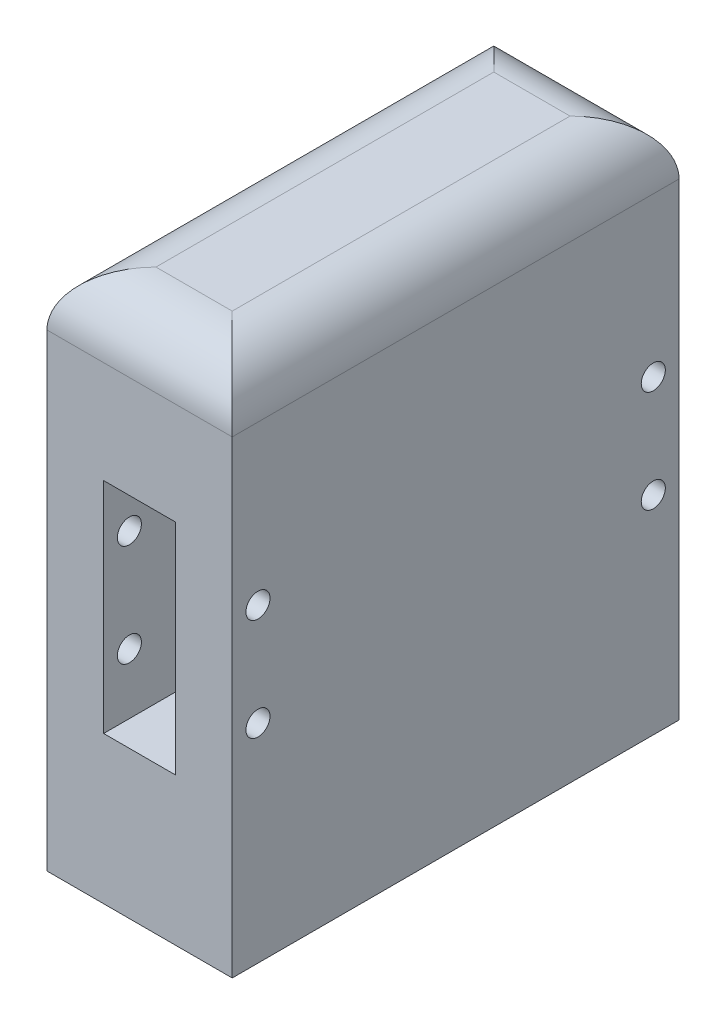
ISO-10303-21;
HEADER;
FILE_DESCRIPTION(('STEP AP214'),'2;1');
FILE_NAME('part.step','',(''),(''),'','','');
FILE_SCHEMA(('AUTOMOTIVE_DESIGN { 1 0 10303 214 1 1 1 1 }'));
ENDSEC;
DATA;
#1=APPLICATION_CONTEXT('core data for automotive mechanical design processes');
#2=APPLICATION_PROTOCOL_DEFINITION('international standard','automotive_design',2000,#1);
#3=PRODUCT_CONTEXT('',#1,'mechanical');
#4=PRODUCT('Part','Part','',(#3));
#5=PRODUCT_RELATED_PRODUCT_CATEGORY('part','',(#4));
#6=PRODUCT_DEFINITION_FORMATION('','',#4);
#7=PRODUCT_DEFINITION_CONTEXT('part definition',#1,'design');
#8=PRODUCT_DEFINITION('design','',#6,#7);
#9=PRODUCT_DEFINITION_SHAPE('','',#8);
#10=(LENGTH_UNIT() NAMED_UNIT(*) SI_UNIT(.MILLI.,.METRE.));
#11=(NAMED_UNIT(*) PLANE_ANGLE_UNIT() SI_UNIT($,.RADIAN.));
#12=(NAMED_UNIT(*) SI_UNIT($,.STERADIAN.) SOLID_ANGLE_UNIT());
#13=UNCERTAINTY_MEASURE_WITH_UNIT(LENGTH_MEASURE(1.E-05),#10,'distance_accuracy_value','');
#14=(GEOMETRIC_REPRESENTATION_CONTEXT(3) GLOBAL_UNCERTAINTY_ASSIGNED_CONTEXT((#13)) GLOBAL_UNIT_ASSIGNED_CONTEXT((#10,
#11,#12)) REPRESENTATION_CONTEXT('',''));
#15=CARTESIAN_POINT('',(0.,0.,0.));
#16=DIRECTION('',(0.,0.,1.));
#17=DIRECTION('',(1.,0.,0.));
#18=AXIS2_PLACEMENT_3D('',#15,#16,#17);
#19=CARTESIAN_POINT('',(-3.3,13.5324143557873,20.5));
#20=DIRECTION('',(-1.,0.,0.));
#21=DIRECTION('',(0.,0.,1.));
#22=AXIS2_PLACEMENT_3D('',#19,#20,#21);
#23=PLANE('',#22);
#24=CARTESIAN_POINT('',(-3.3,19.075341505193,-18.138));
#25=DIRECTION('',(-1.,0.,0.));
#26=DIRECTION('',(0.,0.,1.));
#27=AXIS2_PLACEMENT_3D('',#24,#25,#26);
#28=CIRCLE('',#27,1.105);
#29=CARTESIAN_POINT('',(-3.3,19.075341505193,-17.033));
#30=VERTEX_POINT('',#29);
#31=EDGE_CURVE('E322',#30,#30,#28,.T.);
#32=ORIENTED_EDGE('',*,*,#31,.T.);
#33=EDGE_LOOP('',(#32));
#34=FACE_BOUND('',#33,.T.);
#35=CARTESIAN_POINT('',(-3.3,28.455341505193,-18.138));
#36=DIRECTION('',(-1.,0.,0.));
#37=DIRECTION('',(0.,0.,1.));
#38=AXIS2_PLACEMENT_3D('',#35,#36,#37);
#39=CIRCLE('',#38,1.105);
#40=CARTESIAN_POINT('',(-3.3,28.455341505193,-17.033));
#41=VERTEX_POINT('',#40);
#42=EDGE_CURVE('E318',#41,#41,#39,.T.);
#43=ORIENTED_EDGE('',*,*,#42,.T.);
#44=EDGE_LOOP('',(#43));
#45=FACE_BOUND('',#44,.T.);
#46=DIRECTION('',(0.,1.,0.));
#47=VECTOR('',#46,1.);
#48=CARTESIAN_POINT('',(-3.3,13.5324143557873,-13.6722928862132));
#49=LINE('',#48,#47);
#50=CARTESIAN_POINT('',(-3.3,27.,-13.6722928862132));
#51=VERTEX_POINT('',#50);
#52=CARTESIAN_POINT('',(-3.3,33.6324143557873,-13.6722928862132));
#53=VERTEX_POINT('',#52);
#54=EDGE_CURVE('E261',#51,#53,#49,.T.);
#55=ORIENTED_EDGE('',*,*,#54,.F.);
#56=DIRECTION('',(0.,0.,1.));
#57=VECTOR('',#56,1.);
#58=CARTESIAN_POINT('',(-3.3,27.,20.5));
#59=LINE('',#58,#57);
#60=CARTESIAN_POINT('',(-3.3,27.,-5.48361194834208));
#61=VERTEX_POINT('',#60);
#62=EDGE_CURVE('E245',#51,#61,#59,.T.);
#63=ORIENTED_EDGE('',*,*,#62,.T.);
#64=DIRECTION('',(0.,-1.,0.));
#65=VECTOR('',#64,1.);
#66=CARTESIAN_POINT('',(-3.3,42.,-5.48361194834208));
#67=LINE('',#66,#65);
#68=CARTESIAN_POINT('',(-3.3,13.5324143557873,-5.48361194834208));
#69=VERTEX_POINT('',#68);
#70=EDGE_CURVE('E283',#61,#69,#67,.T.);
#71=ORIENTED_EDGE('',*,*,#70,.T.);
#72=DIRECTION('',(0.,0.,-1.));
#73=VECTOR('',#72,1.);
#74=CARTESIAN_POINT('',(-3.3,13.5324143557873,20.5));
#75=LINE('',#74,#73);
#76=CARTESIAN_POINT('',(-3.3,13.5324143557873,-20.5));
#77=VERTEX_POINT('',#76);
#78=EDGE_CURVE('E354',#69,#77,#75,.T.);
#79=ORIENTED_EDGE('',*,*,#78,.T.);
#80=DIRECTION('',(0.,1.,0.));
#81=VECTOR('',#80,1.);
#82=CARTESIAN_POINT('',(-3.3,13.5324143557873,-20.5));
#83=LINE('',#82,#81);
#84=CARTESIAN_POINT('',(-3.3,33.6324143557873,-20.5));
#85=VERTEX_POINT('',#84);
#86=EDGE_CURVE('E325',#77,#85,#83,.T.);
#87=ORIENTED_EDGE('',*,*,#86,.T.);
#88=DIRECTION('',(0.,0.,-1.));
#89=VECTOR('',#88,1.);
#90=CARTESIAN_POINT('',(-3.3,33.6324143557873,20.5));
#91=LINE('',#90,#89);
#92=EDGE_CURVE('E339',#53,#85,#91,.T.);
#93=ORIENTED_EDGE('',*,*,#92,.F.);
#94=EDGE_LOOP('',(#55,#63,#71,#79,#87,#93));
#95=FACE_BOUND('',#94,.T.);
#96=ADVANCED_FACE('F33',(#34,#45,#95),#23,.F.);
#97=CARTESIAN_POINT('',(3.3,13.5324143557873,20.5));
#98=DIRECTION('',(1.,0.,0.));
#99=DIRECTION('',(0.,0.,-1.));
#100=AXIS2_PLACEMENT_3D('',#97,#98,#99);
#101=PLANE('',#100);
#102=CARTESIAN_POINT('',(3.3,28.455341505193,18.138));
#103=DIRECTION('',(1.,0.,0.));
#104=DIRECTION('',(0.,0.,-1.));
#105=AXIS2_PLACEMENT_3D('',#102,#103,#104);
#106=CIRCLE('',#105,1.105);
#107=CARTESIAN_POINT('',(3.3,28.455341505193,17.033));
#108=VERTEX_POINT('',#107);
#109=EDGE_CURVE('E313',#108,#108,#106,.T.);
#110=ORIENTED_EDGE('',*,*,#109,.T.);
#111=EDGE_LOOP('',(#110));
#112=FACE_BOUND('',#111,.T.);
#113=CARTESIAN_POINT('',(3.3,19.075341505193,18.138));
#114=DIRECTION('',(1.,0.,0.));
#115=DIRECTION('',(0.,0.,-1.));
#116=AXIS2_PLACEMENT_3D('',#113,#114,#115);
#117=CIRCLE('',#116,1.105);
#118=CARTESIAN_POINT('',(3.3,19.075341505193,17.033));
#119=VERTEX_POINT('',#118);
#120=EDGE_CURVE('E307',#119,#119,#117,.T.);
#121=ORIENTED_EDGE('',*,*,#120,.T.);
#122=EDGE_LOOP('',(#121));
#123=FACE_BOUND('',#122,.T.);
#124=DIRECTION('',(0.,1.,0.));
#125=VECTOR('',#124,1.);
#126=CARTESIAN_POINT('',(3.3,13.5324143557873,13.6722928862132));
#127=LINE('',#126,#125);
#128=CARTESIAN_POINT('',(3.3,27.,13.6722928862132));
#129=VERTEX_POINT('',#128);
#130=CARTESIAN_POINT('',(3.3,33.6324143557873,13.6722928862132));
#131=VERTEX_POINT('',#130);
#132=EDGE_CURVE('E257',#129,#131,#127,.T.);
#133=ORIENTED_EDGE('',*,*,#132,.F.);
#134=DIRECTION('',(0.,0.,-1.));
#135=VECTOR('',#134,1.);
#136=CARTESIAN_POINT('',(3.3,27.,20.5));
#137=LINE('',#136,#135);
#138=CARTESIAN_POINT('',(3.3,27.,5.48361194834208));
#139=VERTEX_POINT('',#138);
#140=EDGE_CURVE('E222',#129,#139,#137,.T.);
#141=ORIENTED_EDGE('',*,*,#140,.T.);
#142=DIRECTION('',(0.,-1.,0.));
#143=VECTOR('',#142,1.);
#144=CARTESIAN_POINT('',(3.3,42.,5.48361194834208));
#145=LINE('',#144,#143);
#146=CARTESIAN_POINT('',(3.3,13.5324143557873,5.48361194834208));
#147=VERTEX_POINT('',#146);
#148=EDGE_CURVE('E266',#139,#147,#145,.T.);
#149=ORIENTED_EDGE('',*,*,#148,.T.);
#150=DIRECTION('',(0.,0.,-1.));
#151=VECTOR('',#150,1.);
#152=CARTESIAN_POINT('',(3.3,13.5324143557873,20.5));
#153=LINE('',#152,#151);
#154=CARTESIAN_POINT('',(3.3,13.5324143557873,20.5));
#155=VERTEX_POINT('',#154);
#156=EDGE_CURVE('E355',#155,#147,#153,.T.);
#157=ORIENTED_EDGE('',*,*,#156,.F.);
#158=DIRECTION('',(0.,-1.,0.));
#159=VECTOR('',#158,1.);
#160=CARTESIAN_POINT('',(3.3,13.5324143557873,20.5));
#161=LINE('',#160,#159);
#162=CARTESIAN_POINT('',(3.3,33.6324143557873,20.5));
#163=VERTEX_POINT('',#162);
#164=EDGE_CURVE('E333',#163,#155,#161,.T.);
#165=ORIENTED_EDGE('',*,*,#164,.F.);
#166=DIRECTION('',(0.,0.,-1.));
#167=VECTOR('',#166,1.);
#168=CARTESIAN_POINT('',(3.3,33.6324143557873,20.5));
#169=LINE('',#168,#167);
#170=EDGE_CURVE('E359',#163,#131,#169,.T.);
#171=ORIENTED_EDGE('',*,*,#170,.T.);
#172=EDGE_LOOP('',(#133,#141,#149,#157,#165,#171));
#173=FACE_BOUND('',#172,.T.);
#174=ADVANCED_FACE('F500',(#112,#123,#173),#101,.F.);
#175=CARTESIAN_POINT('',(3.3,33.6324143557873,20.5));
#176=DIRECTION('',(0.,1.,0.));
#177=DIRECTION('',(0.,0.,1.));
#178=AXIS2_PLACEMENT_3D('',#175,#176,#177);
#179=PLANE('',#178);
#180=DIRECTION('',(1.,0.,0.));
#181=VECTOR('',#180,1.);
#182=CARTESIAN_POINT('',(3.3,33.6324143557873,-13.6722928862132));
#183=LINE('',#182,#181);
#184=CARTESIAN_POINT('',(3.3,33.6324143557873,-13.6722928862132));
#185=VERTEX_POINT('',#184);
#186=EDGE_CURVE('E259',#53,#185,#183,.T.);
#187=ORIENTED_EDGE('',*,*,#186,.F.);
#188=ORIENTED_EDGE('',*,*,#92,.T.);
#189=DIRECTION('',(1.,0.,0.));
#190=VECTOR('',#189,1.);
#191=CARTESIAN_POINT('',(3.3,33.6324143557873,-20.5));
#192=LINE('',#191,#190);
#193=CARTESIAN_POINT('',(3.3,33.6324143557873,-20.5));
#194=VERTEX_POINT('',#193);
#195=EDGE_CURVE('E342',#85,#194,#192,.T.);
#196=ORIENTED_EDGE('',*,*,#195,.T.);
#197=EDGE_CURVE('E362',#185,#194,#169,.T.);
#198=ORIENTED_EDGE('',*,*,#197,.F.);
#199=EDGE_LOOP('',(#187,#188,#196,#198));
#200=FACE_BOUND('',#199,.T.);
#201=ADVANCED_FACE('F557',(#200),#179,.F.);
#202=CARTESIAN_POINT('',(-3.3,19.075341505193,18.138));
#203=DIRECTION('',(-1.,0.,0.));
#204=DIRECTION('',(0.,0.,1.));
#205=AXIS2_PLACEMENT_3D('',#202,#203,#204);
#206=CIRCLE('',#205,1.105);
#207=CARTESIAN_POINT('',(-3.3,19.075341505193,19.243));
#208=VERTEX_POINT('',#207);
#209=EDGE_CURVE('E310',#208,#208,#206,.T.);
#210=ORIENTED_EDGE('',*,*,#209,.T.);
#211=EDGE_LOOP('',(#210));
#212=FACE_BOUND('',#211,.T.);
#213=CARTESIAN_POINT('',(-3.3,28.455341505193,18.138));
#214=DIRECTION('',(-1.,0.,0.));
#215=DIRECTION('',(0.,0.,1.));
#216=AXIS2_PLACEMENT_3D('',#213,#214,#215);
#217=CIRCLE('',#216,1.105);
#218=CARTESIAN_POINT('',(-3.3,28.455341505193,19.243));
#219=VERTEX_POINT('',#218);
#220=EDGE_CURVE('E314',#219,#219,#217,.T.);
#221=ORIENTED_EDGE('',*,*,#220,.T.);
#222=EDGE_LOOP('',(#221));
#223=FACE_BOUND('',#222,.T.);
#224=DIRECTION('',(0.,-1.,0.));
#225=VECTOR('',#224,1.);
#226=CARTESIAN_POINT('',(-3.3,13.5324143557873,13.6722928862132));
#227=LINE('',#226,#225);
#228=CARTESIAN_POINT('',(-3.3,33.6324143557873,13.6722928862132));
#229=VERTEX_POINT('',#228);
#230=CARTESIAN_POINT('',(-3.3,27.,13.6722928862132));
#231=VERTEX_POINT('',#230);
#232=EDGE_CURVE('E255',#229,#231,#227,.T.);
#233=ORIENTED_EDGE('',*,*,#232,.F.);
#234=CARTESIAN_POINT('',(-3.3,33.6324143557873,20.5));
#235=VERTEX_POINT('',#234);
#236=EDGE_CURVE('E363',#235,#229,#91,.T.);
#237=ORIENTED_EDGE('',*,*,#236,.F.);
#238=DIRECTION('',(0.,1.,0.));
#239=VECTOR('',#238,1.);
#240=CARTESIAN_POINT('',(-3.3,13.5324143557873,20.5));
#241=LINE('',#240,#239);
#242=CARTESIAN_POINT('',(-3.3,13.5324143557873,20.5));
#243=VERTEX_POINT('',#242);
#244=EDGE_CURVE('E326',#243,#235,#241,.T.);
#245=ORIENTED_EDGE('',*,*,#244,.F.);
#246=CARTESIAN_POINT('',(-3.3,13.5324143557873,5.48361194834208));
#247=VERTEX_POINT('',#246);
#248=EDGE_CURVE('E350',#243,#247,#75,.T.);
#249=ORIENTED_EDGE('',*,*,#248,.T.);
#250=DIRECTION('',(0.,-1.,0.));
#251=VECTOR('',#250,1.);
#252=CARTESIAN_POINT('',(-3.3,42.,5.48361194834208));
#253=LINE('',#252,#251);
#254=CARTESIAN_POINT('',(-3.3,27.,5.48361194834208));
#255=VERTEX_POINT('',#254);
#256=EDGE_CURVE('E276',#247,#255,#253,.F.);
#257=ORIENTED_EDGE('',*,*,#256,.T.);
#258=DIRECTION('',(0.,0.,1.));
#259=VECTOR('',#258,1.);
#260=CARTESIAN_POINT('',(-3.3,27.,20.5));
#261=LINE('',#260,#259);
#262=EDGE_CURVE('E252',#255,#231,#261,.T.);
#263=ORIENTED_EDGE('',*,*,#262,.T.);
#264=EDGE_LOOP('',(#233,#237,#245,#249,#257,#263));
#265=FACE_BOUND('',#264,.T.);
#266=ADVANCED_FACE('F493',(#212,#223,#265),#23,.F.);
#267=CARTESIAN_POINT('',(3.3,28.455341505193,-18.138));
#268=DIRECTION('',(1.,0.,0.));
#269=DIRECTION('',(0.,0.,-1.));
#270=AXIS2_PLACEMENT_3D('',#267,#268,#269);
#271=CIRCLE('',#270,1.105);
#272=CARTESIAN_POINT('',(3.3,28.455341505193,-19.243));
#273=VERTEX_POINT('',#272);
#274=EDGE_CURVE('E317',#273,#273,#271,.T.);
#275=ORIENTED_EDGE('',*,*,#274,.T.);
#276=EDGE_LOOP('',(#275));
#277=FACE_BOUND('',#276,.T.);
#278=CARTESIAN_POINT('',(3.3,19.075341505193,-18.138));
#279=DIRECTION('',(1.,0.,0.));
#280=DIRECTION('',(0.,0.,-1.));
#281=AXIS2_PLACEMENT_3D('',#278,#279,#280);
#282=CIRCLE('',#281,1.105);
#283=CARTESIAN_POINT('',(3.3,19.075341505193,-19.243));
#284=VERTEX_POINT('',#283);
#285=EDGE_CURVE('E321',#284,#284,#282,.T.);
#286=ORIENTED_EDGE('',*,*,#285,.T.);
#287=EDGE_LOOP('',(#286));
#288=FACE_BOUND('',#287,.T.);
#289=DIRECTION('',(0.,-1.,0.));
#290=VECTOR('',#289,1.);
#291=CARTESIAN_POINT('',(3.3,13.5324143557873,-13.6722928862132));
#292=LINE('',#291,#290);
#293=CARTESIAN_POINT('',(3.3,27.,-13.6722928862132));
#294=VERTEX_POINT('',#293);
#295=EDGE_CURVE('E11',#185,#294,#292,.T.);
#296=ORIENTED_EDGE('',*,*,#295,.F.);
#297=ORIENTED_EDGE('',*,*,#197,.T.);
#298=DIRECTION('',(0.,-1.,0.));
#299=VECTOR('',#298,1.);
#300=CARTESIAN_POINT('',(3.3,13.5324143557873,-20.5));
#301=LINE('',#300,#299);
#302=CARTESIAN_POINT('',(3.3,13.5324143557873,-20.5));
#303=VERTEX_POINT('',#302);
#304=EDGE_CURVE('E345',#194,#303,#301,.T.);
#305=ORIENTED_EDGE('',*,*,#304,.T.);
#306=CARTESIAN_POINT('',(3.3,13.5324143557873,-5.48361194834208));
#307=VERTEX_POINT('',#306);
#308=EDGE_CURVE('E358',#307,#303,#153,.T.);
#309=ORIENTED_EDGE('',*,*,#308,.F.);
#310=DIRECTION('',(0.,-1.,0.));
#311=VECTOR('',#310,1.);
#312=CARTESIAN_POINT('',(3.3,42.,-5.48361194834208));
#313=LINE('',#312,#311);
#314=CARTESIAN_POINT('',(3.3,27.,-5.48361194834208));
#315=VERTEX_POINT('',#314);
#316=EDGE_CURVE('E280',#307,#315,#313,.F.);
#317=ORIENTED_EDGE('',*,*,#316,.T.);
#318=DIRECTION('',(0.,0.,-1.));
#319=VECTOR('',#318,1.);
#320=CARTESIAN_POINT('',(3.3,27.,20.5));
#321=LINE('',#320,#319);
#322=EDGE_CURVE('E248',#315,#294,#321,.T.);
#323=ORIENTED_EDGE('',*,*,#322,.T.);
#324=EDGE_LOOP('',(#296,#297,#305,#309,#317,#323));
#325=FACE_BOUND('',#324,.T.);
#326=ADVANCED_FACE('F442',(#277,#288,#325),#101,.F.);
#327=DIRECTION('',(-1.,0.,0.));
#328=VECTOR('',#327,1.);
#329=CARTESIAN_POINT('',(3.3,33.6324143557873,13.6722928862132));
#330=LINE('',#329,#328);
#331=EDGE_CURVE('E41',#131,#229,#330,.T.);
#332=ORIENTED_EDGE('',*,*,#331,.F.);
#333=ORIENTED_EDGE('',*,*,#170,.F.);
#334=DIRECTION('',(1.,0.,0.));
#335=VECTOR('',#334,1.);
#336=CARTESIAN_POINT('',(3.3,33.6324143557873,20.5));
#337=LINE('',#336,#335);
#338=EDGE_CURVE('E329',#235,#163,#337,.T.);
#339=ORIENTED_EDGE('',*,*,#338,.F.);
#340=ORIENTED_EDGE('',*,*,#236,.T.);
#341=EDGE_LOOP('',(#332,#333,#339,#340));
#342=FACE_BOUND('',#341,.T.);
#343=ADVANCED_FACE('F503',(#342),#179,.F.);
#344=CARTESIAN_POINT('',(0.,42.,0.));
#345=DIRECTION('',(0.,-1.,0.));
#346=DIRECTION('',(0.,0.,-1.));
#347=AXIS2_PLACEMENT_3D('',#344,#345,#346);
#348=CYLINDRICAL_SURFACE('',#347,6.4);
#349=CARTESIAN_POINT('',(0.,0.,0.));
#350=DIRECTION('',(0.,-1.,0.));
#351=DIRECTION('',(0.,0.,-1.));
#352=AXIS2_PLACEMENT_3D('',#349,#350,#351);
#353=CIRCLE('',#352,6.4);
#354=CARTESIAN_POINT('',(0.,0.,-6.4));
#355=VERTEX_POINT('',#354);
#356=EDGE_CURVE('E268',#355,#355,#353,.T.);
#357=ORIENTED_EDGE('',*,*,#356,.T.);
#358=EDGE_LOOP('',(#357));
#359=FACE_BOUND('',#358,.T.);
#360=DIRECTION('',(0.,-1.,0.));
#361=VECTOR('',#360,1.);
#362=CARTESIAN_POINT('',(-4.,42.,4.99599839871872));
#363=LINE('',#362,#361);
#364=CARTESIAN_POINT('',(-4.,27.,4.99599839871872));
#365=VERTEX_POINT('',#364);
#366=CARTESIAN_POINT('',(-4.,42.,4.99599839871872));
#367=VERTEX_POINT('',#366);
#368=EDGE_CURVE('E235',#365,#367,#363,.F.);
#369=ORIENTED_EDGE('',*,*,#368,.F.);
#370=CARTESIAN_POINT('',(0.,27.,0.));
#371=DIRECTION('',(0.,-1.,0.));
#372=DIRECTION('',(0.,0.,-1.));
#373=AXIS2_PLACEMENT_3D('',#370,#371,#372);
#374=CIRCLE('',#373,6.4);
#375=EDGE_CURVE('E422',#365,#255,#374,.F.);
#376=ORIENTED_EDGE('',*,*,#375,.T.);
#377=ORIENTED_EDGE('',*,*,#256,.F.);
#378=CARTESIAN_POINT('',(0.,13.5324143557873,0.));
#379=DIRECTION('',(0.,-1.,0.));
#380=DIRECTION('',(0.,0.,-1.));
#381=AXIS2_PLACEMENT_3D('',#378,#379,#380);
#382=CIRCLE('',#381,6.4);
#383=EDGE_CURVE('E273',#147,#247,#382,.T.);
#384=ORIENTED_EDGE('',*,*,#383,.F.);
#385=ORIENTED_EDGE('',*,*,#148,.F.);
#386=CARTESIAN_POINT('',(4.,27.,4.99599839871872));
#387=VERTEX_POINT('',#386);
#388=EDGE_CURVE('E426',#139,#387,#374,.F.);
#389=ORIENTED_EDGE('',*,*,#388,.T.);
#390=DIRECTION('',(0.,-1.,0.));
#391=VECTOR('',#390,1.);
#392=CARTESIAN_POINT('',(4.,42.,4.99599839871872));
#393=LINE('',#392,#391);
#394=CARTESIAN_POINT('',(4.,42.,4.99599839871872));
#395=VERTEX_POINT('',#394);
#396=EDGE_CURVE('E212',#395,#387,#393,.T.);
#397=ORIENTED_EDGE('',*,*,#396,.F.);
#398=CARTESIAN_POINT('',(0.,42.,0.));
#399=DIRECTION('',(0.,-1.,0.));
#400=DIRECTION('',(0.,0.,-1.));
#401=AXIS2_PLACEMENT_3D('',#398,#399,#400);
#402=CIRCLE('',#401,6.4);
#403=CARTESIAN_POINT('',(4.,42.,-4.99599839871872));
#404=VERTEX_POINT('',#403);
#405=EDGE_CURVE('E264',#404,#395,#402,.T.);
#406=ORIENTED_EDGE('',*,*,#405,.F.);
#407=DIRECTION('',(0.,-1.,0.));
#408=VECTOR('',#407,1.);
#409=CARTESIAN_POINT('',(4.,42.,-4.99599839871872));
#410=LINE('',#409,#408);
#411=CARTESIAN_POINT('',(4.,27.,-4.99599839871872));
#412=VERTEX_POINT('',#411);
#413=EDGE_CURVE('E243',#412,#404,#410,.F.);
#414=ORIENTED_EDGE('',*,*,#413,.F.);
#415=EDGE_CURVE('E421',#412,#315,#374,.F.);
#416=ORIENTED_EDGE('',*,*,#415,.T.);
#417=ORIENTED_EDGE('',*,*,#316,.F.);
#418=EDGE_CURVE('E277',#69,#307,#382,.T.);
#419=ORIENTED_EDGE('',*,*,#418,.F.);
#420=ORIENTED_EDGE('',*,*,#70,.F.);
#421=CARTESIAN_POINT('',(-4.,27.,-4.99599839871872));
#422=VERTEX_POINT('',#421);
#423=EDGE_CURVE('E411',#61,#422,#374,.F.);
#424=ORIENTED_EDGE('',*,*,#423,.T.);
#425=DIRECTION('',(0.,-1.,0.));
#426=VECTOR('',#425,1.);
#427=CARTESIAN_POINT('',(-4.,42.,-4.99599839871872));
#428=LINE('',#427,#426);
#429=CARTESIAN_POINT('',(-4.,42.,-4.99599839871872));
#430=VERTEX_POINT('',#429);
#431=EDGE_CURVE('E232',#430,#422,#428,.T.);
#432=ORIENTED_EDGE('',*,*,#431,.F.);
#433=EDGE_CURVE('E267',#367,#430,#402,.T.);
#434=ORIENTED_EDGE('',*,*,#433,.F.);
#435=EDGE_LOOP('',(#369,#376,#377,#384,#385,#389,#397,#406,#414,#416,#417,#419,#420,#424,#432,#434));
#436=FACE_BOUND('',#435,.T.);
#437=ADVANCED_FACE('F432',(#359,#436),#348,.F.);
#438=CARTESIAN_POINT('',(3.3,13.5324143557873,20.5));
#439=DIRECTION('',(0.,-1.,0.));
#440=DIRECTION('',(0.,0.,-1.));
#441=AXIS2_PLACEMENT_3D('',#438,#439,#440);
#442=PLANE('',#441);
#443=CARTESIAN_POINT('',(0.,13.5324143557873,12.));
#444=DIRECTION('',(0.,-1.,0.));
#445=DIRECTION('',(0.,0.,-1.));
#446=AXIS2_PLACEMENT_3D('',#443,#444,#445);
#447=CIRCLE('',#446,1.25);
#448=CARTESIAN_POINT('',(0.,13.5324143557873,10.75));
#449=VERTEX_POINT('',#448);
#450=EDGE_CURVE('E905',#449,#449,#447,.T.);
#451=ORIENTED_EDGE('',*,*,#450,.T.);
#452=EDGE_LOOP('',(#451));
#453=FACE_BOUND('',#452,.T.);
#454=ORIENTED_EDGE('',*,*,#156,.T.);
#455=ORIENTED_EDGE('',*,*,#383,.T.);
#456=ORIENTED_EDGE('',*,*,#248,.F.);
#457=DIRECTION('',(-1.,0.,0.));
#458=VECTOR('',#457,1.);
#459=CARTESIAN_POINT('',(3.3,13.5324143557873,20.5));
#460=LINE('',#459,#458);
#461=EDGE_CURVE('E336',#155,#243,#460,.T.);
#462=ORIENTED_EDGE('',*,*,#461,.F.);
#463=EDGE_LOOP('',(#454,#455,#456,#462));
#464=FACE_BOUND('',#463,.T.);
#465=ADVANCED_FACE('F497',(#453,#464),#442,.F.);
#466=CARTESIAN_POINT('',(8.5,48.,20.5));
#467=DIRECTION('',(-1.,0.,0.));
#468=DIRECTION('',(0.,0.,1.));
#469=AXIS2_PLACEMENT_3D('',#466,#467,#468);
#470=PLANE('',#469);
#471=CARTESIAN_POINT('',(8.5,19.075341505193,-18.138));
#472=DIRECTION('',(1.,0.,0.));
#473=DIRECTION('',(0.,0.,1.));
#474=AXIS2_PLACEMENT_3D('',#471,#472,#473);
#475=CIRCLE('',#474,1.105);
#476=CARTESIAN_POINT('',(8.5,19.075341505193,-17.033));
#477=VERTEX_POINT('',#476);
#478=EDGE_CURVE('E285',#477,#477,#475,.T.);
#479=ORIENTED_EDGE('',*,*,#478,.F.);
#480=EDGE_LOOP('',(#479));
#481=FACE_BOUND('',#480,.T.);
#482=CARTESIAN_POINT('',(8.5,28.455341505193,-18.138));
#483=DIRECTION('',(1.,0.,0.));
#484=DIRECTION('',(0.,0.,1.));
#485=AXIS2_PLACEMENT_3D('',#482,#483,#484);
#486=CIRCLE('',#485,1.105);
#487=CARTESIAN_POINT('',(8.5,28.455341505193,-17.033));
#488=VERTEX_POINT('',#487);
#489=EDGE_CURVE('E296',#488,#488,#486,.T.);
#490=ORIENTED_EDGE('',*,*,#489,.F.);
#491=EDGE_LOOP('',(#490));
#492=FACE_BOUND('',#491,.T.);
#493=CARTESIAN_POINT('',(8.5,28.455341505193,18.138));
#494=DIRECTION('',(1.,0.,0.));
#495=DIRECTION('',(0.,0.,-1.));
#496=AXIS2_PLACEMENT_3D('',#493,#494,#495);
#497=CIRCLE('',#496,1.105);
#498=CARTESIAN_POINT('',(8.5,28.455341505193,17.033));
#499=VERTEX_POINT('',#498);
#500=EDGE_CURVE('E290',#499,#499,#497,.T.);
#501=ORIENTED_EDGE('',*,*,#500,.F.);
#502=EDGE_LOOP('',(#501));
#503=FACE_BOUND('',#502,.T.);
#504=CARTESIAN_POINT('',(8.5,19.075341505193,18.138));
#505=DIRECTION('',(1.,0.,0.));
#506=DIRECTION('',(0.,0.,-1.));
#507=AXIS2_PLACEMENT_3D('',#504,#505,#506);
#508=CIRCLE('',#507,1.105);
#509=CARTESIAN_POINT('',(8.5,19.075341505193,17.033));
#510=VERTEX_POINT('',#509);
#511=EDGE_CURVE('E289',#510,#510,#508,.T.);
#512=ORIENTED_EDGE('',*,*,#511,.F.);
#513=EDGE_LOOP('',(#512));
#514=FACE_BOUND('',#513,.T.);
#515=DIRECTION('',(0.,-1.,0.));
#516=VECTOR('',#515,1.);
#517=CARTESIAN_POINT('',(8.5,48.,-20.5));
#518=LINE('',#517,#516);
#519=CARTESIAN_POINT('',(8.5,43.,-20.5));
#520=VERTEX_POINT('',#519);
#521=CARTESIAN_POINT('',(8.5,0.,-20.5));
#522=VERTEX_POINT('',#521);
#523=EDGE_CURVE('E383',#520,#522,#518,.T.);
#524=ORIENTED_EDGE('',*,*,#523,.F.);
#525=DIRECTION('',(0.,0.,-1.));
#526=VECTOR('',#525,1.);
#527=CARTESIAN_POINT('',(8.5,43.,20.5));
#528=LINE('',#527,#526);
#529=CARTESIAN_POINT('',(8.5,43.,20.5));
#530=VERTEX_POINT('',#529);
#531=EDGE_CURVE('E409',#520,#530,#528,.F.);
#532=ORIENTED_EDGE('',*,*,#531,.T.);
#533=DIRECTION('',(0.,-1.,0.));
#534=VECTOR('',#533,1.);
#535=CARTESIAN_POINT('',(8.5,48.,20.5));
#536=LINE('',#535,#534);
#537=CARTESIAN_POINT('',(8.5,0.,20.5));
#538=VERTEX_POINT('',#537);
#539=EDGE_CURVE('E377',#530,#538,#536,.T.);
#540=ORIENTED_EDGE('',*,*,#539,.T.);
#541=DIRECTION('',(0.,0.,-1.));
#542=VECTOR('',#541,1.);
#543=CARTESIAN_POINT('',(8.5,0.,20.5));
#544=LINE('',#543,#542);
#545=EDGE_CURVE('E353',#538,#522,#544,.T.);
#546=ORIENTED_EDGE('',*,*,#545,.T.);
#547=EDGE_LOOP('',(#524,#532,#540,#546));
#548=FACE_BOUND('',#547,.T.);
#549=ADVANCED_FACE('F610',(#481,#492,#503,#514,#548),#470,.F.);
#550=CARTESIAN_POINT('',(-8.5,48.,-20.5));
#551=DIRECTION('',(0.,0.,1.));
#552=DIRECTION('',(1.,0.,0.));
#553=AXIS2_PLACEMENT_3D('',#550,#551,#552);
#554=PLANE('',#553);
#555=ORIENTED_EDGE('',*,*,#195,.F.);
#556=ORIENTED_EDGE('',*,*,#86,.F.);
#557=DIRECTION('',(-1.,0.,0.));
#558=VECTOR('',#557,1.);
#559=CARTESIAN_POINT('',(3.3,13.5324143557873,-20.5));
#560=LINE('',#559,#558);
#561=EDGE_CURVE('E330',#303,#77,#560,.T.);
#562=ORIENTED_EDGE('',*,*,#561,.F.);
#563=ORIENTED_EDGE('',*,*,#304,.F.);
#564=EDGE_LOOP('',(#555,#556,#562,#563));
#565=FACE_BOUND('',#564,.T.);
#566=DIRECTION('',(0.,-1.,0.));
#567=VECTOR('',#566,1.);
#568=CARTESIAN_POINT('',(-8.5,48.,-20.5));
#569=LINE('',#568,#567);
#570=CARTESIAN_POINT('',(-8.5,43.,-20.5));
#571=VERTEX_POINT('',#570);
#572=CARTESIAN_POINT('',(-8.5,0.,-20.5));
#573=VERTEX_POINT('',#572);
#574=EDGE_CURVE('E381',#571,#573,#569,.T.);
#575=ORIENTED_EDGE('',*,*,#574,.F.);
#576=DIRECTION('',(-1.,0.,0.));
#577=VECTOR('',#576,1.);
#578=CARTESIAN_POINT('',(-8.5,43.,-20.5));
#579=LINE('',#578,#577);
#580=EDGE_CURVE('E407',#571,#520,#579,.F.);
#581=ORIENTED_EDGE('',*,*,#580,.T.);
#582=ORIENTED_EDGE('',*,*,#523,.T.);
#583=DIRECTION('',(-1.,0.,0.));
#584=VECTOR('',#583,1.);
#585=CARTESIAN_POINT('',(-8.5,0.,-20.5));
#586=LINE('',#585,#584);
#587=EDGE_CURVE('E368',#522,#573,#586,.T.);
#588=ORIENTED_EDGE('',*,*,#587,.T.);
#589=EDGE_LOOP('',(#575,#581,#582,#588));
#590=FACE_BOUND('',#589,.T.);
#591=ADVANCED_FACE('F539',(#565,#590),#554,.F.);
#592=CARTESIAN_POINT('',(-8.5,48.,20.5));
#593=DIRECTION('',(1.,0.,0.));
#594=DIRECTION('',(0.,0.,-1.));
#595=AXIS2_PLACEMENT_3D('',#592,#593,#594);
#596=PLANE('',#595);
#597=CARTESIAN_POINT('',(-8.5,19.075341505193,-18.138));
#598=DIRECTION('',(1.,0.,0.));
#599=DIRECTION('',(0.,0.,1.));
#600=AXIS2_PLACEMENT_3D('',#597,#598,#599);
#601=CIRCLE('',#600,1.105);
#602=CARTESIAN_POINT('',(-8.5,19.075341505193,-17.033));
#603=VERTEX_POINT('',#602);
#604=EDGE_CURVE('E299',#603,#603,#601,.T.);
#605=ORIENTED_EDGE('',*,*,#604,.T.);
#606=EDGE_LOOP('',(#605));
#607=FACE_BOUND('',#606,.T.);
#608=CARTESIAN_POINT('',(-8.5,28.455341505193,-18.138));
#609=DIRECTION('',(1.,0.,0.));
#610=DIRECTION('',(0.,0.,1.));
#611=AXIS2_PLACEMENT_3D('',#608,#609,#610);
#612=CIRCLE('',#611,1.105);
#613=CARTESIAN_POINT('',(-8.5,28.455341505193,-17.033));
#614=VERTEX_POINT('',#613);
#615=EDGE_CURVE('E293',#614,#614,#612,.T.);
#616=ORIENTED_EDGE('',*,*,#615,.T.);
#617=EDGE_LOOP('',(#616));
#618=FACE_BOUND('',#617,.T.);
#619=CARTESIAN_POINT('',(-8.5,28.455341505193,18.138));
#620=DIRECTION('',(1.,0.,0.));
#621=DIRECTION('',(0.,0.,-1.));
#622=AXIS2_PLACEMENT_3D('',#619,#620,#621);
#623=CIRCLE('',#622,1.105);
#624=CARTESIAN_POINT('',(-8.5,28.455341505193,17.033));
#625=VERTEX_POINT('',#624);
#626=EDGE_CURVE('E286',#625,#625,#623,.T.);
#627=ORIENTED_EDGE('',*,*,#626,.T.);
#628=EDGE_LOOP('',(#627));
#629=FACE_BOUND('',#628,.T.);
#630=CARTESIAN_POINT('',(-8.5,19.075341505193,18.138));
#631=DIRECTION('',(1.,0.,0.));
#632=DIRECTION('',(0.,0.,-1.));
#633=AXIS2_PLACEMENT_3D('',#630,#631,#632);
#634=CIRCLE('',#633,1.105);
#635=CARTESIAN_POINT('',(-8.5,19.075341505193,17.033));
#636=VERTEX_POINT('',#635);
#637=EDGE_CURVE('E304',#636,#636,#634,.T.);
#638=ORIENTED_EDGE('',*,*,#637,.T.);
#639=EDGE_LOOP('',(#638));
#640=FACE_BOUND('',#639,.T.);
#641=DIRECTION('',(0.,-1.,0.));
#642=VECTOR('',#641,1.);
#643=CARTESIAN_POINT('',(-8.5,48.,20.5));
#644=LINE('',#643,#642);
#645=CARTESIAN_POINT('',(-8.5,43.,20.5));
#646=VERTEX_POINT('',#645);
#647=CARTESIAN_POINT('',(-8.5,0.,20.5));
#648=VERTEX_POINT('',#647);
#649=EDGE_CURVE('E379',#646,#648,#644,.T.);
#650=ORIENTED_EDGE('',*,*,#649,.F.);
#651=DIRECTION('',(0.,0.,1.));
#652=VECTOR('',#651,1.);
#653=CARTESIAN_POINT('',(-8.5,43.,20.5));
#654=LINE('',#653,#652);
#655=EDGE_CURVE('E405',#646,#571,#654,.F.);
#656=ORIENTED_EDGE('',*,*,#655,.T.);
#657=ORIENTED_EDGE('',*,*,#574,.T.);
#658=DIRECTION('',(0.,0.,1.));
#659=VECTOR('',#658,1.);
#660=CARTESIAN_POINT('',(-8.5,0.,20.5));
#661=LINE('',#660,#659);
#662=EDGE_CURVE('E371',#573,#648,#661,.T.);
#663=ORIENTED_EDGE('',*,*,#662,.T.);
#664=EDGE_LOOP('',(#650,#656,#657,#663));
#665=FACE_BOUND('',#664,.T.);
#666=ADVANCED_FACE('F510',(#607,#618,#629,#640,#665),#596,.F.);
#667=CARTESIAN_POINT('',(-8.5,48.,20.5));
#668=DIRECTION('',(0.,0.,-1.));
#669=DIRECTION('',(-1.,0.,0.));
#670=AXIS2_PLACEMENT_3D('',#667,#668,#669);
#671=PLANE('',#670);
#672=ORIENTED_EDGE('',*,*,#461,.T.);
#673=ORIENTED_EDGE('',*,*,#244,.T.);
#674=ORIENTED_EDGE('',*,*,#338,.T.);
#675=ORIENTED_EDGE('',*,*,#164,.T.);
#676=EDGE_LOOP('',(#672,#673,#674,#675));
#677=FACE_BOUND('',#676,.T.);
#678=ORIENTED_EDGE('',*,*,#539,.F.);
#679=DIRECTION('',(1.,0.,0.));
#680=VECTOR('',#679,1.);
#681=CARTESIAN_POINT('',(-8.5,43.,20.5));
#682=LINE('',#681,#680);
#683=EDGE_CURVE('E402',#530,#646,#682,.F.);
#684=ORIENTED_EDGE('',*,*,#683,.T.);
#685=ORIENTED_EDGE('',*,*,#649,.T.);
#686=DIRECTION('',(1.,0.,0.));
#687=VECTOR('',#686,1.);
#688=CARTESIAN_POINT('',(-8.5,0.,20.5));
#689=LINE('',#688,#687);
#690=EDGE_CURVE('E374',#648,#538,#689,.T.);
#691=ORIENTED_EDGE('',*,*,#690,.T.);
#692=EDGE_LOOP('',(#678,#684,#685,#691));
#693=FACE_BOUND('',#692,.T.);
#694=ADVANCED_FACE('F506',(#677,#693),#671,.F.);
#695=CARTESIAN_POINT('',(0.,48.,0.));
#696=DIRECTION('',(0.,-1.,0.));
#697=DIRECTION('',(0.,0.,-1.));
#698=AXIS2_PLACEMENT_3D('',#695,#696,#697);
#699=PLANE('',#698);
#700=DIRECTION('',(0.,0.,1.));
#701=VECTOR('',#700,1.);
#702=CARTESIAN_POINT('',(-3.5,48.,0.));
#703=LINE('',#702,#701);
#704=CARTESIAN_POINT('',(-3.5,48.,-15.5));
#705=VERTEX_POINT('',#704);
#706=CARTESIAN_POINT('',(-3.5,48.,15.5));
#707=VERTEX_POINT('',#706);
#708=EDGE_CURVE('E397',#705,#707,#703,.T.);
#709=ORIENTED_EDGE('',*,*,#708,.T.);
#710=DIRECTION('',(1.,0.,0.));
#711=VECTOR('',#710,1.);
#712=CARTESIAN_POINT('',(0.,48.,15.5));
#713=LINE('',#712,#711);
#714=CARTESIAN_POINT('',(3.5,48.,15.5));
#715=VERTEX_POINT('',#714);
#716=EDGE_CURVE('E399',#707,#715,#713,.T.);
#717=ORIENTED_EDGE('',*,*,#716,.T.);
#718=DIRECTION('',(0.,0.,-1.));
#719=VECTOR('',#718,1.);
#720=CARTESIAN_POINT('',(3.5,48.,0.));
#721=LINE('',#720,#719);
#722=CARTESIAN_POINT('',(3.5,48.,-15.5));
#723=VERTEX_POINT('',#722);
#724=EDGE_CURVE('E385',#715,#723,#721,.T.);
#725=ORIENTED_EDGE('',*,*,#724,.T.);
#726=DIRECTION('',(-1.,0.,0.));
#727=VECTOR('',#726,1.);
#728=CARTESIAN_POINT('',(0.,48.,-15.5));
#729=LINE('',#728,#727);
#730=EDGE_CURVE('E395',#723,#705,#729,.T.);
#731=ORIENTED_EDGE('',*,*,#730,.T.);
#732=EDGE_LOOP('',(#709,#717,#725,#731));
#733=FACE_BOUND('',#732,.T.);
#734=ADVANCED_FACE('F509',(#733),#699,.F.);
#735=CARTESIAN_POINT('',(0.,0.,0.));
#736=DIRECTION('',(0.,-1.,0.));
#737=DIRECTION('',(0.,0.,-1.));
#738=AXIS2_PLACEMENT_3D('',#735,#736,#737);
#739=PLANE('',#738);
#740=CARTESIAN_POINT('',(0.,0.,-12.));
#741=DIRECTION('',(0.,-1.,0.));
#742=DIRECTION('',(0.,0.,-1.));
#743=AXIS2_PLACEMENT_3D('',#740,#741,#742);
#744=CIRCLE('',#743,1.24999999999999);
#745=CARTESIAN_POINT('',(0.,0.,-13.25));
#746=VERTEX_POINT('',#745);
#747=EDGE_CURVE('E915',#746,#746,#744,.T.);
#748=ORIENTED_EDGE('',*,*,#747,.F.);
#749=EDGE_LOOP('',(#748));
#750=FACE_BOUND('',#749,.T.);
#751=CARTESIAN_POINT('',(0.,0.,12.));
#752=DIRECTION('',(0.,-1.,0.));
#753=DIRECTION('',(0.,0.,-1.));
#754=AXIS2_PLACEMENT_3D('',#751,#752,#753);
#755=CIRCLE('',#754,1.24999999999999);
#756=CARTESIAN_POINT('',(0.,0.,10.75));
#757=VERTEX_POINT('',#756);
#758=EDGE_CURVE('E906',#757,#757,#755,.T.);
#759=ORIENTED_EDGE('',*,*,#758,.F.);
#760=EDGE_LOOP('',(#759));
#761=FACE_BOUND('',#760,.T.);
#762=ORIENTED_EDGE('',*,*,#356,.F.);
#763=EDGE_LOOP('',(#762));
#764=FACE_BOUND('',#763,.T.);
#765=ORIENTED_EDGE('',*,*,#545,.F.);
#766=ORIENTED_EDGE('',*,*,#690,.F.);
#767=ORIENTED_EDGE('',*,*,#662,.F.);
#768=ORIENTED_EDGE('',*,*,#587,.F.);
#769=EDGE_LOOP('',(#765,#766,#767,#768));
#770=FACE_BOUND('',#769,.T.);
#771=ADVANCED_FACE('F617',(#750,#761,#764,#770),#739,.T.);
#772=CARTESIAN_POINT('',(0.,13.5324143557873,-12.));
#773=DIRECTION('',(0.,-1.,0.));
#774=DIRECTION('',(0.,0.,-1.));
#775=AXIS2_PLACEMENT_3D('',#772,#773,#774);
#776=CIRCLE('',#775,1.24999999999999);
#777=CARTESIAN_POINT('',(0.,13.5324143557873,-13.25));
#778=VERTEX_POINT('',#777);
#779=EDGE_CURVE('E909',#778,#778,#776,.F.);
#780=ORIENTED_EDGE('',*,*,#779,.F.);
#781=EDGE_LOOP('',(#780));
#782=FACE_BOUND('',#781,.T.);
#783=ORIENTED_EDGE('',*,*,#78,.F.);
#784=ORIENTED_EDGE('',*,*,#418,.T.);
#785=ORIENTED_EDGE('',*,*,#308,.T.);
#786=ORIENTED_EDGE('',*,*,#561,.T.);
#787=EDGE_LOOP('',(#783,#784,#785,#786));
#788=FACE_BOUND('',#787,.T.);
#789=ADVANCED_FACE('F447',(#782,#788),#442,.F.);
#790=CARTESIAN_POINT('',(-8.5,19.075341505193,18.138));
#791=DIRECTION('',(1.,0.,0.));
#792=DIRECTION('',(0.,0.,-1.));
#793=AXIS2_PLACEMENT_3D('',#790,#791,#792);
#794=CYLINDRICAL_SURFACE('',#793,1.105);
#795=ORIENTED_EDGE('',*,*,#511,.T.);
#796=EDGE_LOOP('',(#795));
#797=FACE_BOUND('',#796,.T.);
#798=ORIENTED_EDGE('',*,*,#120,.F.);
#799=EDGE_LOOP('',(#798));
#800=FACE_BOUND('',#799,.T.);
#801=ADVANCED_FACE('F592',(#797,#800),#794,.F.);
#802=CARTESIAN_POINT('',(-8.5,28.455341505193,18.138));
#803=DIRECTION('',(1.,0.,0.));
#804=DIRECTION('',(0.,0.,-1.));
#805=AXIS2_PLACEMENT_3D('',#802,#803,#804);
#806=CYLINDRICAL_SURFACE('',#805,1.105);
#807=ORIENTED_EDGE('',*,*,#500,.T.);
#808=EDGE_LOOP('',(#807));
#809=FACE_BOUND('',#808,.T.);
#810=ORIENTED_EDGE('',*,*,#109,.F.);
#811=EDGE_LOOP('',(#810));
#812=FACE_BOUND('',#811,.T.);
#813=ADVANCED_FACE('F581',(#809,#812),#806,.F.);
#814=CARTESIAN_POINT('',(-8.5,28.455341505193,-18.138));
#815=DIRECTION('',(1.,0.,0.));
#816=DIRECTION('',(0.,0.,-1.));
#817=AXIS2_PLACEMENT_3D('',#814,#815,#816);
#818=CYLINDRICAL_SURFACE('',#817,1.105);
#819=ORIENTED_EDGE('',*,*,#489,.T.);
#820=EDGE_LOOP('',(#819));
#821=FACE_BOUND('',#820,.T.);
#822=ORIENTED_EDGE('',*,*,#274,.F.);
#823=EDGE_LOOP('',(#822));
#824=FACE_BOUND('',#823,.T.);
#825=ADVANCED_FACE('F588',(#821,#824),#818,.F.);
#826=CARTESIAN_POINT('',(-8.5,19.075341505193,-18.138));
#827=DIRECTION('',(1.,0.,0.));
#828=DIRECTION('',(0.,0.,-1.));
#829=AXIS2_PLACEMENT_3D('',#826,#827,#828);
#830=CYLINDRICAL_SURFACE('',#829,1.105);
#831=ORIENTED_EDGE('',*,*,#478,.T.);
#832=EDGE_LOOP('',(#831));
#833=FACE_BOUND('',#832,.T.);
#834=ORIENTED_EDGE('',*,*,#285,.F.);
#835=EDGE_LOOP('',(#834));
#836=FACE_BOUND('',#835,.T.);
#837=ADVANCED_FACE('F589',(#833,#836),#830,.F.);
#838=ORIENTED_EDGE('',*,*,#637,.F.);
#839=EDGE_LOOP('',(#838));
#840=FACE_BOUND('',#839,.T.);
#841=ORIENTED_EDGE('',*,*,#209,.F.);
#842=EDGE_LOOP('',(#841));
#843=FACE_BOUND('',#842,.T.);
#844=ADVANCED_FACE('F578',(#840,#843),#794,.F.);
#845=ORIENTED_EDGE('',*,*,#626,.F.);
#846=EDGE_LOOP('',(#845));
#847=FACE_BOUND('',#846,.T.);
#848=ORIENTED_EDGE('',*,*,#220,.F.);
#849=EDGE_LOOP('',(#848));
#850=FACE_BOUND('',#849,.T.);
#851=ADVANCED_FACE('F575',(#847,#850),#806,.F.);
#852=ORIENTED_EDGE('',*,*,#615,.F.);
#853=EDGE_LOOP('',(#852));
#854=FACE_BOUND('',#853,.T.);
#855=ORIENTED_EDGE('',*,*,#42,.F.);
#856=EDGE_LOOP('',(#855));
#857=FACE_BOUND('',#856,.T.);
#858=ADVANCED_FACE('F577',(#854,#857),#818,.F.);
#859=ORIENTED_EDGE('',*,*,#604,.F.);
#860=EDGE_LOOP('',(#859));
#861=FACE_BOUND('',#860,.T.);
#862=ORIENTED_EDGE('',*,*,#31,.F.);
#863=EDGE_LOOP('',(#862));
#864=FACE_BOUND('',#863,.T.);
#865=ADVANCED_FACE('F549',(#861,#864),#830,.F.);
#866=CARTESIAN_POINT('',(0.,42.,0.));
#867=DIRECTION('',(0.,-1.,0.));
#868=DIRECTION('',(0.,0.,-1.));
#869=AXIS2_PLACEMENT_3D('',#866,#867,#868);
#870=PLANE('',#869);
#871=ORIENTED_EDGE('',*,*,#433,.T.);
#872=DIRECTION('',(0.,0.,-1.));
#873=VECTOR('',#872,1.);
#874=CARTESIAN_POINT('',(-4.,42.,13.6722928862132));
#875=LINE('',#874,#873);
#876=CARTESIAN_POINT('',(-4.,42.,-13.6722928862132));
#877=VERTEX_POINT('',#876);
#878=EDGE_CURVE('E477',#430,#877,#875,.T.);
#879=ORIENTED_EDGE('',*,*,#878,.T.);
#880=DIRECTION('',(1.,0.,0.));
#881=VECTOR('',#880,1.);
#882=CARTESIAN_POINT('',(-4.,42.,-13.6722928862132));
#883=LINE('',#882,#881);
#884=CARTESIAN_POINT('',(4.,42.,-13.6722928862132));
#885=VERTEX_POINT('',#884);
#886=EDGE_CURVE('E216',#877,#885,#883,.T.);
#887=ORIENTED_EDGE('',*,*,#886,.T.);
#888=DIRECTION('',(0.,0.,1.));
#889=VECTOR('',#888,1.);
#890=CARTESIAN_POINT('',(4.,42.,13.6722928862132));
#891=LINE('',#890,#889);
#892=EDGE_CURVE('E55',#885,#404,#891,.T.);
#893=ORIENTED_EDGE('',*,*,#892,.T.);
#894=ORIENTED_EDGE('',*,*,#405,.T.);
#895=CARTESIAN_POINT('',(4.,42.,13.6722928862132));
#896=VERTEX_POINT('',#895);
#897=EDGE_CURVE('E475',#395,#896,#891,.T.);
#898=ORIENTED_EDGE('',*,*,#897,.T.);
#899=DIRECTION('',(-1.,0.,0.));
#900=VECTOR('',#899,1.);
#901=CARTESIAN_POINT('',(-4.,42.,13.6722928862132));
#902=LINE('',#901,#900);
#903=CARTESIAN_POINT('',(-4.,42.,13.6722928862132));
#904=VERTEX_POINT('',#903);
#905=EDGE_CURVE('E231',#896,#904,#902,.T.);
#906=ORIENTED_EDGE('',*,*,#905,.T.);
#907=EDGE_CURVE('E48',#904,#367,#875,.T.);
#908=ORIENTED_EDGE('',*,*,#907,.T.);
#909=EDGE_LOOP('',(#871,#879,#887,#893,#894,#898,#906,#908));
#910=FACE_BOUND('',#909,.T.);
#911=ADVANCED_FACE('F482',(#910),#870,.T.);
#912=CARTESIAN_POINT('',(0.,43.,-15.5));
#913=DIRECTION('',(-1.,0.,0.));
#914=DIRECTION('',(0.,0.,1.));
#915=AXIS2_PLACEMENT_3D('',#912,#913,#914);
#916=CYLINDRICAL_SURFACE('',#915,5.);
#917=CARTESIAN_POINT('',(3.5,43.,-15.5));
#918=DIRECTION('',(-0.707106781186547,0.,-0.707106781186547));
#919=DIRECTION('',(0.707106781186547,0.,-0.707106781186547));
#920=AXIS2_PLACEMENT_3D('',#917,#918,#919);
#921=ELLIPSE('',#920,7.07106781186547,5.);
#922=EDGE_CURVE('E415',#520,#723,#921,.F.);
#923=ORIENTED_EDGE('',*,*,#922,.F.);
#924=ORIENTED_EDGE('',*,*,#580,.F.);
#925=CARTESIAN_POINT('',(-3.5,43.,-15.5));
#926=DIRECTION('',(-0.707106781186547,0.,0.707106781186547));
#927=DIRECTION('',(-0.707106781186547,0.,-0.707106781186547));
#928=AXIS2_PLACEMENT_3D('',#925,#926,#927);
#929=ELLIPSE('',#928,7.07106781186547,5.);
#930=EDGE_CURVE('E271',#705,#571,#929,.T.);
#931=ORIENTED_EDGE('',*,*,#930,.F.);
#932=ORIENTED_EDGE('',*,*,#730,.F.);
#933=EDGE_LOOP('',(#923,#924,#931,#932));
#934=FACE_BOUND('',#933,.T.);
#935=ADVANCED_FACE('F35',(#934),#916,.T.);
#936=CARTESIAN_POINT('',(-3.5,43.,0.));
#937=DIRECTION('',(0.,0.,1.));
#938=DIRECTION('',(1.,0.,0.));
#939=AXIS2_PLACEMENT_3D('',#936,#937,#938);
#940=CYLINDRICAL_SURFACE('',#939,5.);
#941=ORIENTED_EDGE('',*,*,#930,.T.);
#942=ORIENTED_EDGE('',*,*,#655,.F.);
#943=CARTESIAN_POINT('',(-3.5,43.,15.5));
#944=DIRECTION('',(0.707106781186547,0.,0.707106781186547));
#945=DIRECTION('',(-0.707106781186547,0.,0.707106781186547));
#946=AXIS2_PLACEMENT_3D('',#943,#944,#945);
#947=ELLIPSE('',#946,7.07106781186547,5.);
#948=EDGE_CURVE('E413',#707,#646,#947,.T.);
#949=ORIENTED_EDGE('',*,*,#948,.F.);
#950=ORIENTED_EDGE('',*,*,#708,.F.);
#951=EDGE_LOOP('',(#941,#942,#949,#950));
#952=FACE_BOUND('',#951,.T.);
#953=ADVANCED_FACE('F534',(#952),#940,.T.);
#954=CARTESIAN_POINT('',(3.5,43.,0.));
#955=DIRECTION('',(0.,0.,-1.));
#956=DIRECTION('',(-1.,0.,0.));
#957=AXIS2_PLACEMENT_3D('',#954,#955,#956);
#958=CYLINDRICAL_SURFACE('',#957,5.);
#959=ORIENTED_EDGE('',*,*,#922,.T.);
#960=ORIENTED_EDGE('',*,*,#724,.F.);
#961=CARTESIAN_POINT('',(3.5,43.,15.5));
#962=DIRECTION('',(0.707106781186547,0.,-0.707106781186547));
#963=DIRECTION('',(-0.707106781186547,0.,-0.707106781186547));
#964=AXIS2_PLACEMENT_3D('',#961,#962,#963);
#965=ELLIPSE('',#964,7.07106781186547,5.);
#966=EDGE_CURVE('E263',#530,#715,#965,.F.);
#967=ORIENTED_EDGE('',*,*,#966,.F.);
#968=ORIENTED_EDGE('',*,*,#531,.F.);
#969=EDGE_LOOP('',(#959,#960,#967,#968));
#970=FACE_BOUND('',#969,.T.);
#971=ADVANCED_FACE('F527',(#970),#958,.T.);
#972=CARTESIAN_POINT('',(0.,43.,15.5));
#973=DIRECTION('',(1.,0.,0.));
#974=DIRECTION('',(0.,0.,-1.));
#975=AXIS2_PLACEMENT_3D('',#972,#973,#974);
#976=CYLINDRICAL_SURFACE('',#975,5.);
#977=ORIENTED_EDGE('',*,*,#948,.T.);
#978=ORIENTED_EDGE('',*,*,#683,.F.);
#979=ORIENTED_EDGE('',*,*,#966,.T.);
#980=ORIENTED_EDGE('',*,*,#716,.F.);
#981=EDGE_LOOP('',(#977,#978,#979,#980));
#982=FACE_BOUND('',#981,.T.);
#983=ADVANCED_FACE('F520',(#982),#976,.T.);
#984=CARTESIAN_POINT('',(-4.,27.,13.6722928862132));
#985=DIRECTION('',(1.,0.,0.));
#986=DIRECTION('',(0.,0.,-1.));
#987=AXIS2_PLACEMENT_3D('',#984,#985,#986);
#988=PLANE('',#987);
#989=ORIENTED_EDGE('',*,*,#431,.T.);
#990=DIRECTION('',(0.,0.,-1.));
#991=VECTOR('',#990,1.);
#992=CARTESIAN_POINT('',(-4.,27.,13.6722928862132));
#993=LINE('',#992,#991);
#994=CARTESIAN_POINT('',(-4.,27.,-13.6722928862132));
#995=VERTEX_POINT('',#994);
#996=EDGE_CURVE('E225',#422,#995,#993,.T.);
#997=ORIENTED_EDGE('',*,*,#996,.T.);
#998=DIRECTION('',(0.,1.,0.));
#999=VECTOR('',#998,1.);
#1000=CARTESIAN_POINT('',(-4.,27.,-13.6722928862132));
#1001=LINE('',#1000,#999);
#1002=EDGE_CURVE('E237',#995,#877,#1001,.T.);
#1003=ORIENTED_EDGE('',*,*,#1002,.T.);
#1004=ORIENTED_EDGE('',*,*,#878,.F.);
#1005=EDGE_LOOP('',(#989,#997,#1003,#1004));
#1006=FACE_BOUND('',#1005,.T.);
#1007=ADVANCED_FACE('F480',(#1006),#988,.T.);
#1008=CARTESIAN_POINT('',(4.,27.,13.6722928862132));
#1009=DIRECTION('',(-1.,0.,0.));
#1010=DIRECTION('',(0.,0.,1.));
#1011=AXIS2_PLACEMENT_3D('',#1008,#1009,#1010);
#1012=PLANE('',#1011);
#1013=ORIENTED_EDGE('',*,*,#413,.T.);
#1014=ORIENTED_EDGE('',*,*,#892,.F.);
#1015=DIRECTION('',(0.,1.,0.));
#1016=VECTOR('',#1015,1.);
#1017=CARTESIAN_POINT('',(4.,27.,-13.6722928862132));
#1018=LINE('',#1017,#1016);
#1019=CARTESIAN_POINT('',(4.,27.,-13.6722928862132));
#1020=VERTEX_POINT('',#1019);
#1021=EDGE_CURVE('E466',#1020,#885,#1018,.T.);
#1022=ORIENTED_EDGE('',*,*,#1021,.F.);
#1023=DIRECTION('',(0.,0.,1.));
#1024=VECTOR('',#1023,1.);
#1025=CARTESIAN_POINT('',(4.,27.,13.6722928862132));
#1026=LINE('',#1025,#1024);
#1027=EDGE_CURVE('E215',#1020,#412,#1026,.T.);
#1028=ORIENTED_EDGE('',*,*,#1027,.T.);
#1029=EDGE_LOOP('',(#1013,#1014,#1022,#1028));
#1030=FACE_BOUND('',#1029,.T.);
#1031=ADVANCED_FACE('F653',(#1030),#1012,.T.);
#1032=CARTESIAN_POINT('',(0.,27.,0.));
#1033=DIRECTION('',(0.,-1.,0.));
#1034=DIRECTION('',(0.,0.,-1.));
#1035=AXIS2_PLACEMENT_3D('',#1032,#1033,#1034);
#1036=PLANE('',#1035);
#1037=DIRECTION('',(1.,0.,0.));
#1038=VECTOR('',#1037,1.);
#1039=CARTESIAN_POINT('',(-4.,27.,-13.6722928862132));
#1040=LINE('',#1039,#1038);
#1041=EDGE_CURVE('E459',#995,#51,#1040,.T.);
#1042=ORIENTED_EDGE('',*,*,#1041,.F.);
#1043=ORIENTED_EDGE('',*,*,#996,.F.);
#1044=ORIENTED_EDGE('',*,*,#423,.F.);
#1045=ORIENTED_EDGE('',*,*,#62,.F.);
#1046=EDGE_LOOP('',(#1042,#1043,#1044,#1045));
#1047=FACE_BOUND('',#1046,.T.);
#1048=ADVANCED_FACE('F457',(#1047),#1036,.F.);
#1049=ORIENTED_EDGE('',*,*,#415,.F.);
#1050=ORIENTED_EDGE('',*,*,#1027,.F.);
#1051=EDGE_CURVE('E467',#294,#1020,#1040,.T.);
#1052=ORIENTED_EDGE('',*,*,#1051,.F.);
#1053=ORIENTED_EDGE('',*,*,#322,.F.);
#1054=EDGE_LOOP('',(#1049,#1050,#1052,#1053));
#1055=FACE_BOUND('',#1054,.T.);
#1056=ADVANCED_FACE('F668',(#1055),#1036,.F.);
#1057=CARTESIAN_POINT('',(-4.,27.,-13.6722928862132));
#1058=DIRECTION('',(0.,0.,1.));
#1059=DIRECTION('',(1.,0.,0.));
#1060=AXIS2_PLACEMENT_3D('',#1057,#1058,#1059);
#1061=PLANE('',#1060);
#1062=ORIENTED_EDGE('',*,*,#54,.T.);
#1063=ORIENTED_EDGE('',*,*,#186,.T.);
#1064=ORIENTED_EDGE('',*,*,#295,.T.);
#1065=ORIENTED_EDGE('',*,*,#1051,.T.);
#1066=ORIENTED_EDGE('',*,*,#1021,.T.);
#1067=ORIENTED_EDGE('',*,*,#886,.F.);
#1068=ORIENTED_EDGE('',*,*,#1002,.F.);
#1069=ORIENTED_EDGE('',*,*,#1041,.T.);
#1070=EDGE_LOOP('',(#1062,#1063,#1064,#1065,#1066,#1067,#1068,#1069));
#1071=FACE_BOUND('',#1070,.T.);
#1072=ADVANCED_FACE('F462',(#1071),#1061,.T.);
#1073=CARTESIAN_POINT('',(-4.,27.,13.6722928862132));
#1074=DIRECTION('',(0.,0.,-1.));
#1075=DIRECTION('',(-1.,0.,0.));
#1076=AXIS2_PLACEMENT_3D('',#1073,#1074,#1075);
#1077=PLANE('',#1076);
#1078=ORIENTED_EDGE('',*,*,#132,.T.);
#1079=ORIENTED_EDGE('',*,*,#331,.T.);
#1080=ORIENTED_EDGE('',*,*,#232,.T.);
#1081=DIRECTION('',(-1.,0.,0.));
#1082=VECTOR('',#1081,1.);
#1083=CARTESIAN_POINT('',(-4.,27.,13.6722928862132));
#1084=LINE('',#1083,#1082);
#1085=CARTESIAN_POINT('',(-4.,27.,13.6722928862132));
#1086=VERTEX_POINT('',#1085);
#1087=EDGE_CURVE('E226',#231,#1086,#1084,.T.);
#1088=ORIENTED_EDGE('',*,*,#1087,.T.);
#1089=DIRECTION('',(0.,1.,0.));
#1090=VECTOR('',#1089,1.);
#1091=CARTESIAN_POINT('',(-4.,27.,13.6722928862132));
#1092=LINE('',#1091,#1090);
#1093=EDGE_CURVE('E233',#1086,#904,#1092,.T.);
#1094=ORIENTED_EDGE('',*,*,#1093,.T.);
#1095=ORIENTED_EDGE('',*,*,#905,.F.);
#1096=DIRECTION('',(0.,1.,0.));
#1097=VECTOR('',#1096,1.);
#1098=CARTESIAN_POINT('',(4.,27.,13.6722928862132));
#1099=LINE('',#1098,#1097);
#1100=CARTESIAN_POINT('',(4.,27.,13.6722928862132));
#1101=VERTEX_POINT('',#1100);
#1102=EDGE_CURVE('E210',#1101,#896,#1099,.T.);
#1103=ORIENTED_EDGE('',*,*,#1102,.F.);
#1104=EDGE_CURVE('E219',#1101,#129,#1084,.T.);
#1105=ORIENTED_EDGE('',*,*,#1104,.T.);
#1106=EDGE_LOOP('',(#1078,#1079,#1080,#1088,#1094,#1095,#1103,#1105));
#1107=FACE_BOUND('',#1106,.T.);
#1108=ADVANCED_FACE('F229',(#1107),#1077,.T.);
#1109=ORIENTED_EDGE('',*,*,#375,.F.);
#1110=EDGE_CURVE('E471',#1086,#365,#993,.T.);
#1111=ORIENTED_EDGE('',*,*,#1110,.F.);
#1112=ORIENTED_EDGE('',*,*,#1087,.F.);
#1113=ORIENTED_EDGE('',*,*,#262,.F.);
#1114=EDGE_LOOP('',(#1109,#1111,#1112,#1113));
#1115=FACE_BOUND('',#1114,.T.);
#1116=ADVANCED_FACE('F491',(#1115),#1036,.F.);
#1117=ORIENTED_EDGE('',*,*,#1104,.F.);
#1118=EDGE_CURVE('E206',#387,#1101,#1026,.T.);
#1119=ORIENTED_EDGE('',*,*,#1118,.F.);
#1120=ORIENTED_EDGE('',*,*,#388,.F.);
#1121=ORIENTED_EDGE('',*,*,#140,.F.);
#1122=EDGE_LOOP('',(#1117,#1119,#1120,#1121));
#1123=FACE_BOUND('',#1122,.T.);
#1124=ADVANCED_FACE('F220',(#1123),#1036,.F.);
#1125=ORIENTED_EDGE('',*,*,#396,.T.);
#1126=ORIENTED_EDGE('',*,*,#1118,.T.);
#1127=ORIENTED_EDGE('',*,*,#1102,.T.);
#1128=ORIENTED_EDGE('',*,*,#897,.F.);
#1129=EDGE_LOOP('',(#1125,#1126,#1127,#1128));
#1130=FACE_BOUND('',#1129,.T.);
#1131=ADVANCED_FACE('F208',(#1130),#1012,.T.);
#1132=ORIENTED_EDGE('',*,*,#368,.T.);
#1133=ORIENTED_EDGE('',*,*,#907,.F.);
#1134=ORIENTED_EDGE('',*,*,#1093,.F.);
#1135=ORIENTED_EDGE('',*,*,#1110,.T.);
#1136=EDGE_LOOP('',(#1132,#1133,#1134,#1135));
#1137=FACE_BOUND('',#1136,.T.);
#1138=ADVANCED_FACE('F488',(#1137),#988,.T.);
#1139=CARTESIAN_POINT('',(0.,0.,12.));
#1140=DIRECTION('',(0.,-1.,0.));
#1141=DIRECTION('',(0.,0.,-1.));
#1142=AXIS2_PLACEMENT_3D('',#1139,#1140,#1141);
#1143=CYLINDRICAL_SURFACE('',#1142,1.24999999999999);
#1144=ORIENTED_EDGE('',*,*,#450,.F.);
#1145=EDGE_LOOP('',(#1144));
#1146=FACE_BOUND('',#1145,.T.);
#1147=ORIENTED_EDGE('',*,*,#758,.T.);
#1148=EDGE_LOOP('',(#1147));
#1149=FACE_BOUND('',#1148,.T.);
#1150=ADVANCED_FACE('F707',(#1146,#1149),#1143,.F.);
#1151=CARTESIAN_POINT('',(0.,0.,-12.));
#1152=DIRECTION('',(0.,-1.,0.));
#1153=DIRECTION('',(0.,0.,-1.));
#1154=AXIS2_PLACEMENT_3D('',#1151,#1152,#1153);
#1155=CYLINDRICAL_SURFACE('',#1154,1.24999999999999);
#1156=ORIENTED_EDGE('',*,*,#779,.T.);
#1157=EDGE_LOOP('',(#1156));
#1158=FACE_BOUND('',#1157,.T.);
#1159=ORIENTED_EDGE('',*,*,#747,.T.);
#1160=EDGE_LOOP('',(#1159));
#1161=FACE_BOUND('',#1160,.T.);
#1162=ADVANCED_FACE('F714',(#1158,#1161),#1155,.F.);
#1163=CLOSED_SHELL('',(#96,#174,#201,#266,#326,#343,#437,#465,#549,#591,#666,#694,#734,#771,
#789,#801,#813,#825,#837,#844,#851,#858,#865,#911,#935,#953,#971,#983,#1007,#1031,#1048,#1056,
#1072,#1108,#1116,#1124,#1131,#1138,#1150,#1162));
#1164=MANIFOLD_SOLID_BREP('B2',#1163);
#1165=ADVANCED_BREP_SHAPE_REPRESENTATION('',(#18,#1164),#14);
#1166=SHAPE_DEFINITION_REPRESENTATION(#9,#1165);
ENDSEC;
END-ISO-10303-21;
